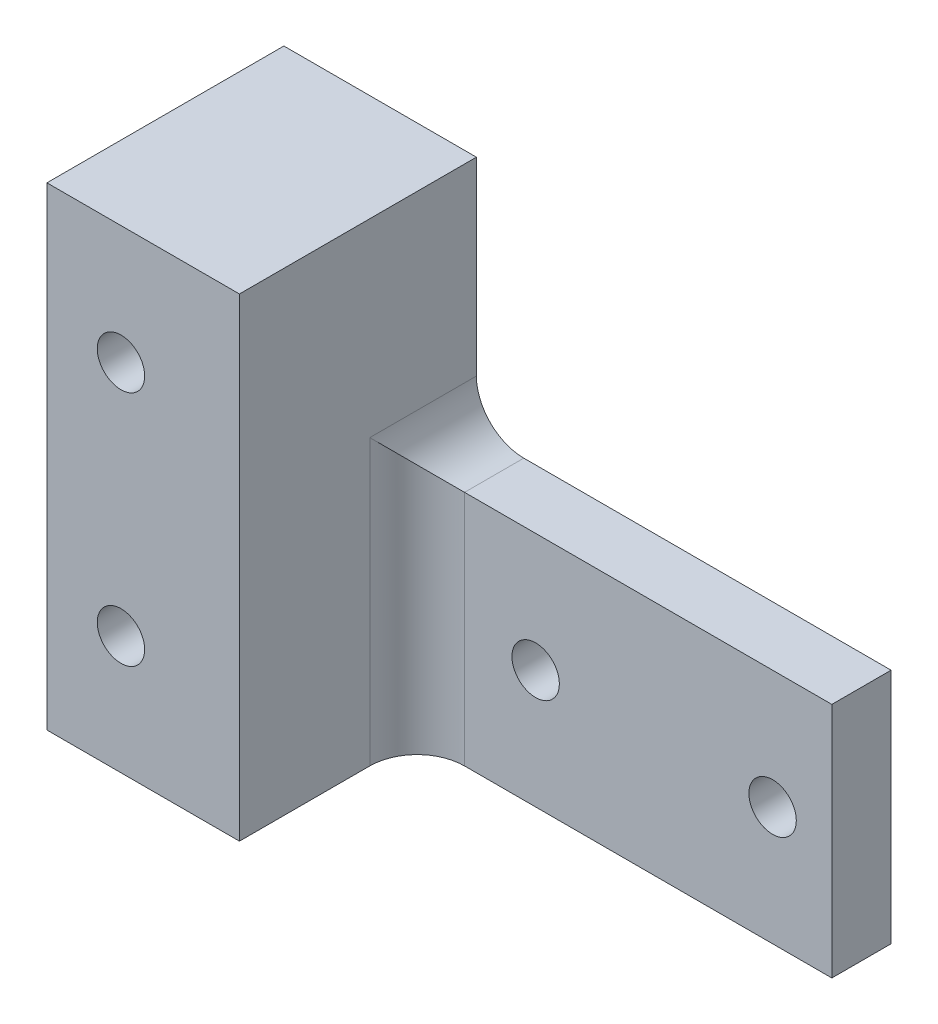
ISO-10303-21;
HEADER;
FILE_DESCRIPTION(('STEP AP214'),'2;1');
FILE_NAME('part.step','',(''),(''),'','','');
FILE_SCHEMA(('AUTOMOTIVE_DESIGN { 1 0 10303 214 1 1 1 1 }'));
ENDSEC;
DATA;
#1=APPLICATION_CONTEXT('core data for automotive mechanical design processes');
#2=APPLICATION_PROTOCOL_DEFINITION('international standard','automotive_design',2000,#1);
#3=PRODUCT_CONTEXT('',#1,'mechanical');
#4=PRODUCT('Part','Part','',(#3));
#5=PRODUCT_RELATED_PRODUCT_CATEGORY('part','',(#4));
#6=PRODUCT_DEFINITION_FORMATION('','',#4);
#7=PRODUCT_DEFINITION_CONTEXT('part definition',#1,'design');
#8=PRODUCT_DEFINITION('design','',#6,#7);
#9=PRODUCT_DEFINITION_SHAPE('','',#8);
#10=(LENGTH_UNIT() NAMED_UNIT(*) SI_UNIT(.MILLI.,.METRE.));
#11=(NAMED_UNIT(*) PLANE_ANGLE_UNIT() SI_UNIT($,.RADIAN.));
#12=(NAMED_UNIT(*) SI_UNIT($,.STERADIAN.) SOLID_ANGLE_UNIT());
#13=UNCERTAINTY_MEASURE_WITH_UNIT(LENGTH_MEASURE(1.E-05),#10,'distance_accuracy_value','');
#14=(GEOMETRIC_REPRESENTATION_CONTEXT(3) GLOBAL_UNCERTAINTY_ASSIGNED_CONTEXT((#13)) GLOBAL_UNIT_ASSIGNED_CONTEXT((#10,
#11,#12)) REPRESENTATION_CONTEXT('',''));
#15=CARTESIAN_POINT('',(0.,0.,0.));
#16=DIRECTION('',(0.,0.,1.));
#17=DIRECTION('',(1.,0.,0.));
#18=AXIS2_PLACEMENT_3D('',#15,#16,#17);
#19=CARTESIAN_POINT('',(12.7,38.1,0.));
#20=DIRECTION('',(0.,0.,1.));
#21=DIRECTION('',(1.,0.,0.));
#22=AXIS2_PLACEMENT_3D('',#19,#20,#21);
#23=CYLINDRICAL_SURFACE('',#22,2.54);
#24=CARTESIAN_POINT('',(12.7,38.1,25.4));
#25=DIRECTION('',(0.,0.,1.));
#26=DIRECTION('',(1.,0.,0.));
#27=AXIS2_PLACEMENT_3D('',#24,#25,#26);
#28=CIRCLE('',#27,2.54);
#29=CARTESIAN_POINT('',(15.24,38.1,25.4));
#30=VERTEX_POINT('',#29);
#31=EDGE_CURVE('E162',#30,#30,#28,.T.);
#32=ORIENTED_EDGE('',*,*,#31,.T.);
#33=EDGE_LOOP('',(#32));
#34=FACE_BOUND('',#33,.T.);
#35=CARTESIAN_POINT('',(12.7,38.1,7.62));
#36=DIRECTION('',(0.,0.,-1.));
#37=DIRECTION('',(-1.,0.,0.));
#38=AXIS2_PLACEMENT_3D('',#35,#36,#37);
#39=CIRCLE('',#38,2.54);
#40=CARTESIAN_POINT('',(10.16,38.1,7.62));
#41=VERTEX_POINT('',#40);
#42=EDGE_CURVE('E49',#41,#41,#39,.F.);
#43=ORIENTED_EDGE('',*,*,#42,.F.);
#44=EDGE_LOOP('',(#43));
#45=FACE_BOUND('',#44,.T.);
#46=ADVANCED_FACE('F45',(#34,#45),#23,.F.);
#47=CARTESIAN_POINT('',(69.85,0.,25.4));
#48=DIRECTION('',(0.,1.,0.));
#49=DIRECTION('',(-1.,0.,0.));
#50=AXIS2_PLACEMENT_3D('',#47,#48,#49);
#51=PLANE('',#50);
#52=DIRECTION('',(0.,0.,-1.));
#53=VECTOR('',#52,1.);
#54=CARTESIAN_POINT('',(69.85,0.,25.4));
#55=LINE('',#54,#53);
#56=CARTESIAN_POINT('',(69.85,0.,6.35));
#57=VERTEX_POINT('',#56);
#58=CARTESIAN_POINT('',(69.85,0.,0.));
#59=VERTEX_POINT('',#58);
#60=EDGE_CURVE('E176',#57,#59,#55,.T.);
#61=ORIENTED_EDGE('',*,*,#60,.F.);
#62=DIRECTION('',(1.,0.,0.));
#63=VECTOR('',#62,1.);
#64=CARTESIAN_POINT('',(69.85,0.,6.35));
#65=LINE('',#64,#63);
#66=CARTESIAN_POINT('',(30.48,0.,6.34999999999999));
#67=VERTEX_POINT('',#66);
#68=EDGE_CURVE('E138',#67,#57,#65,.T.);
#69=ORIENTED_EDGE('',*,*,#68,.F.);
#70=CARTESIAN_POINT('',(30.48,0.,11.43));
#71=DIRECTION('',(0.,1.,0.));
#72=DIRECTION('',(-1.,0.,0.));
#73=AXIS2_PLACEMENT_3D('',#70,#71,#72);
#74=CIRCLE('',#73,5.08);
#75=CARTESIAN_POINT('',(25.4,0.,11.43));
#76=VERTEX_POINT('',#75);
#77=EDGE_CURVE('E12',#67,#76,#74,.T.);
#78=ORIENTED_EDGE('',*,*,#77,.T.);
#79=DIRECTION('',(0.,0.,-1.));
#80=VECTOR('',#79,1.);
#81=CARTESIAN_POINT('',(25.4,0.,25.4));
#82=LINE('',#81,#80);
#83=CARTESIAN_POINT('',(25.4,0.,25.4));
#84=VERTEX_POINT('',#83);
#85=EDGE_CURVE('E119',#84,#76,#82,.T.);
#86=ORIENTED_EDGE('',*,*,#85,.F.);
#87=DIRECTION('',(1.,0.,0.));
#88=VECTOR('',#87,1.);
#89=CARTESIAN_POINT('',(69.85,0.,25.4));
#90=LINE('',#89,#88);
#91=CARTESIAN_POINT('',(4.7625,0.,25.4));
#92=VERTEX_POINT('',#91);
#93=EDGE_CURVE('E129',#92,#84,#90,.T.);
#94=ORIENTED_EDGE('',*,*,#93,.F.);
#95=DIRECTION('',(0.,0.,1.));
#96=VECTOR('',#95,1.);
#97=CARTESIAN_POINT('',(4.7625,0.,0.));
#98=LINE('',#97,#96);
#99=CARTESIAN_POINT('',(4.7625,0.,0.));
#100=VERTEX_POINT('',#99);
#101=EDGE_CURVE('E234',#100,#92,#98,.T.);
#102=ORIENTED_EDGE('',*,*,#101,.F.);
#103=DIRECTION('',(1.,0.,0.));
#104=VECTOR('',#103,1.);
#105=CARTESIAN_POINT('',(69.85,0.,0.));
#106=LINE('',#105,#104);
#107=EDGE_CURVE('E157',#100,#59,#106,.T.);
#108=ORIENTED_EDGE('',*,*,#107,.T.);
#109=EDGE_LOOP('',(#61,#69,#78,#86,#94,#102,#108));
#110=FACE_BOUND('',#109,.T.);
#111=ADVANCED_FACE('F134',(#110),#51,.F.);
#112=CARTESIAN_POINT('',(69.85,25.4,25.4));
#113=DIRECTION('',(-1.,0.,0.));
#114=DIRECTION('',(0.,0.,1.));
#115=AXIS2_PLACEMENT_3D('',#112,#113,#114);
#116=PLANE('',#115);
#117=DIRECTION('',(0.,0.,-1.));
#118=VECTOR('',#117,1.);
#119=CARTESIAN_POINT('',(69.85,25.4,25.4));
#120=LINE('',#119,#118);
#121=CARTESIAN_POINT('',(69.85,25.4,6.35));
#122=VERTEX_POINT('',#121);
#123=CARTESIAN_POINT('',(69.85,25.4,0.));
#124=VERTEX_POINT('',#123);
#125=EDGE_CURVE('E173',#122,#124,#120,.T.);
#126=ORIENTED_EDGE('',*,*,#125,.F.);
#127=DIRECTION('',(0.,-1.,0.));
#128=VECTOR('',#127,1.);
#129=CARTESIAN_POINT('',(69.85,50.8,6.35));
#130=LINE('',#129,#128);
#131=EDGE_CURVE('E185',#122,#57,#130,.T.);
#132=ORIENTED_EDGE('',*,*,#131,.T.);
#133=ORIENTED_EDGE('',*,*,#60,.T.);
#134=DIRECTION('',(0.,1.,0.));
#135=VECTOR('',#134,1.);
#136=CARTESIAN_POINT('',(69.85,25.4,0.));
#137=LINE('',#136,#135);
#138=EDGE_CURVE('E161',#59,#124,#137,.T.);
#139=ORIENTED_EDGE('',*,*,#138,.T.);
#140=EDGE_LOOP('',(#126,#132,#133,#139));
#141=FACE_BOUND('',#140,.T.);
#142=ADVANCED_FACE('F285',(#141),#116,.F.);
#143=CARTESIAN_POINT('',(25.4,25.4,25.4));
#144=DIRECTION('',(0.,-1.,0.));
#145=DIRECTION('',(0.,0.,-1.));
#146=AXIS2_PLACEMENT_3D('',#143,#144,#145);
#147=PLANE('',#146);
#148=DIRECTION('',(-1.,0.,0.));
#149=VECTOR('',#148,1.);
#150=CARTESIAN_POINT('',(25.4,25.4,0.));
#151=LINE('',#150,#149);
#152=CARTESIAN_POINT('',(30.48,25.4,0.));
#153=VERTEX_POINT('',#152);
#154=EDGE_CURVE('E166',#124,#153,#151,.T.);
#155=ORIENTED_EDGE('',*,*,#154,.T.);
#156=DIRECTION('',(0.,0.,-1.));
#157=VECTOR('',#156,1.);
#158=CARTESIAN_POINT('',(30.48,25.4,6.34999999999999));
#159=LINE('',#158,#157);
#160=CARTESIAN_POINT('',(30.48,25.4,6.35));
#161=VERTEX_POINT('',#160);
#162=EDGE_CURVE('E192',#153,#161,#159,.F.);
#163=ORIENTED_EDGE('',*,*,#162,.T.);
#164=DIRECTION('',(1.,0.,0.));
#165=VECTOR('',#164,1.);
#166=CARTESIAN_POINT('',(25.4,25.4,6.34999999999999));
#167=LINE('',#166,#165);
#168=EDGE_CURVE('E227',#161,#122,#167,.T.);
#169=ORIENTED_EDGE('',*,*,#168,.T.);
#170=ORIENTED_EDGE('',*,*,#125,.T.);
#171=EDGE_LOOP('',(#155,#163,#169,#170));
#172=FACE_BOUND('',#171,.T.);
#173=ADVANCED_FACE('F315',(#172),#147,.F.);
#174=CARTESIAN_POINT('',(25.4,50.8,25.4));
#175=DIRECTION('',(-1.,0.,0.));
#176=DIRECTION('',(0.,-1.,0.));
#177=AXIS2_PLACEMENT_3D('',#174,#175,#176);
#178=PLANE('',#177);
#179=DIRECTION('',(0.,-1.,0.));
#180=VECTOR('',#179,1.);
#181=CARTESIAN_POINT('',(25.4,25.4,11.43));
#182=LINE('',#181,#180);
#183=CARTESIAN_POINT('',(25.4,30.48,11.43));
#184=VERTEX_POINT('',#183);
#185=EDGE_CURVE('E179',#76,#184,#182,.F.);
#186=ORIENTED_EDGE('',*,*,#185,.T.);
#187=DIRECTION('',(0.,0.,-1.));
#188=VECTOR('',#187,1.);
#189=CARTESIAN_POINT('',(25.4,30.48,0.));
#190=LINE('',#189,#188);
#191=CARTESIAN_POINT('',(25.4,30.48,0.));
#192=VERTEX_POINT('',#191);
#193=EDGE_CURVE('E188',#184,#192,#190,.T.);
#194=ORIENTED_EDGE('',*,*,#193,.T.);
#195=DIRECTION('',(0.,1.,0.));
#196=VECTOR('',#195,1.);
#197=CARTESIAN_POINT('',(25.4,50.8,0.));
#198=LINE('',#197,#196);
#199=CARTESIAN_POINT('',(25.4,50.8,0.));
#200=VERTEX_POINT('',#199);
#201=EDGE_CURVE('E149',#192,#200,#198,.T.);
#202=ORIENTED_EDGE('',*,*,#201,.T.);
#203=DIRECTION('',(0.,0.,-1.));
#204=VECTOR('',#203,1.);
#205=CARTESIAN_POINT('',(25.4,50.8,25.4));
#206=LINE('',#205,#204);
#207=CARTESIAN_POINT('',(25.4,50.8,25.4));
#208=VERTEX_POINT('',#207);
#209=EDGE_CURVE('E122',#208,#200,#206,.T.);
#210=ORIENTED_EDGE('',*,*,#209,.F.);
#211=DIRECTION('',(0.,1.,0.));
#212=VECTOR('',#211,1.);
#213=CARTESIAN_POINT('',(25.4,50.8,25.4));
#214=LINE('',#213,#212);
#215=EDGE_CURVE('E116',#84,#208,#214,.T.);
#216=ORIENTED_EDGE('',*,*,#215,.F.);
#217=ORIENTED_EDGE('',*,*,#85,.T.);
#218=EDGE_LOOP('',(#186,#194,#202,#210,#216,#217));
#219=FACE_BOUND('',#218,.T.);
#220=ADVANCED_FACE('F118',(#219),#178,.F.);
#221=CARTESIAN_POINT('',(0.,50.8,25.4));
#222=DIRECTION('',(0.,-1.,0.));
#223=DIRECTION('',(0.,0.,-1.));
#224=AXIS2_PLACEMENT_3D('',#221,#222,#223);
#225=PLANE('',#224);
#226=DIRECTION('',(-1.,0.,0.));
#227=VECTOR('',#226,1.);
#228=CARTESIAN_POINT('',(0.,50.8,0.));
#229=LINE('',#228,#227);
#230=CARTESIAN_POINT('',(4.7625,50.8,0.));
#231=VERTEX_POINT('',#230);
#232=EDGE_CURVE('E145',#200,#231,#229,.T.);
#233=ORIENTED_EDGE('',*,*,#232,.T.);
#234=DIRECTION('',(0.,0.,1.));
#235=VECTOR('',#234,1.);
#236=CARTESIAN_POINT('',(4.7625,50.8,0.));
#237=LINE('',#236,#235);
#238=CARTESIAN_POINT('',(4.7625,50.8,25.4));
#239=VERTEX_POINT('',#238);
#240=EDGE_CURVE('E237',#231,#239,#237,.T.);
#241=ORIENTED_EDGE('',*,*,#240,.T.);
#242=DIRECTION('',(-1.,0.,0.));
#243=VECTOR('',#242,1.);
#244=CARTESIAN_POINT('',(0.,50.8,25.4));
#245=LINE('',#244,#243);
#246=EDGE_CURVE('E128',#208,#239,#245,.T.);
#247=ORIENTED_EDGE('',*,*,#246,.F.);
#248=ORIENTED_EDGE('',*,*,#209,.T.);
#249=EDGE_LOOP('',(#233,#241,#247,#248));
#250=FACE_BOUND('',#249,.T.);
#251=ADVANCED_FACE('F304',(#250),#225,.F.);
#252=CARTESIAN_POINT('',(0.,0.,25.4));
#253=DIRECTION('',(0.,0.,-1.));
#254=DIRECTION('',(-1.,0.,0.));
#255=AXIS2_PLACEMENT_3D('',#252,#253,#254);
#256=PLANE('',#255);
#257=ORIENTED_EDGE('',*,*,#31,.F.);
#258=EDGE_LOOP('',(#257));
#259=FACE_BOUND('',#258,.T.);
#260=CARTESIAN_POINT('',(12.7,12.7,25.4));
#261=DIRECTION('',(0.,0.,1.));
#262=DIRECTION('',(1.,0.,0.));
#263=AXIS2_PLACEMENT_3D('',#260,#261,#262);
#264=CIRCLE('',#263,2.54);
#265=CARTESIAN_POINT('',(15.24,12.7,25.4));
#266=VERTEX_POINT('',#265);
#267=EDGE_CURVE('E250',#266,#266,#264,.T.);
#268=ORIENTED_EDGE('',*,*,#267,.F.);
#269=EDGE_LOOP('',(#268));
#270=FACE_BOUND('',#269,.T.);
#271=ORIENTED_EDGE('',*,*,#93,.T.);
#272=ORIENTED_EDGE('',*,*,#215,.T.);
#273=ORIENTED_EDGE('',*,*,#246,.T.);
#274=DIRECTION('',(0.,1.,0.));
#275=VECTOR('',#274,1.);
#276=CARTESIAN_POINT('',(4.7625,0.,25.4));
#277=LINE('',#276,#275);
#278=EDGE_CURVE('E143',#92,#239,#277,.T.);
#279=ORIENTED_EDGE('',*,*,#278,.F.);
#280=EDGE_LOOP('',(#271,#272,#273,#279));
#281=FACE_BOUND('',#280,.T.);
#282=ADVANCED_FACE('F142',(#259,#270,#281),#256,.F.);
#283=CARTESIAN_POINT('',(0.,0.,0.));
#284=DIRECTION('',(0.,0.,-1.));
#285=DIRECTION('',(-1.,0.,0.));
#286=AXIS2_PLACEMENT_3D('',#283,#284,#285);
#287=PLANE('',#286);
#288=CARTESIAN_POINT('',(12.7,38.1,0.));
#289=DIRECTION('',(0.,0.,-1.));
#290=DIRECTION('',(-1.,0.,0.));
#291=AXIS2_PLACEMENT_3D('',#288,#289,#290);
#292=CIRCLE('',#291,4.064);
#293=CARTESIAN_POINT('',(8.636,38.1,0.));
#294=VERTEX_POINT('',#293);
#295=EDGE_CURVE('E211',#294,#294,#292,.T.);
#296=ORIENTED_EDGE('',*,*,#295,.F.);
#297=EDGE_LOOP('',(#296));
#298=FACE_BOUND('',#297,.T.);
#299=DIRECTION('',(0.,1.,0.));
#300=VECTOR('',#299,1.);
#301=CARTESIAN_POINT('',(4.7625,0.,0.));
#302=LINE('',#301,#300);
#303=EDGE_CURVE('E230',#100,#231,#302,.T.);
#304=ORIENTED_EDGE('',*,*,#303,.T.);
#305=ORIENTED_EDGE('',*,*,#232,.F.);
#306=ORIENTED_EDGE('',*,*,#201,.F.);
#307=CARTESIAN_POINT('',(30.48,30.48,0.));
#308=DIRECTION('',(0.,0.,-1.));
#309=DIRECTION('',(-1.,0.,0.));
#310=AXIS2_PLACEMENT_3D('',#307,#308,#309);
#311=CIRCLE('',#310,5.08);
#312=EDGE_CURVE('E55',#192,#153,#311,.F.);
#313=ORIENTED_EDGE('',*,*,#312,.T.);
#314=ORIENTED_EDGE('',*,*,#154,.F.);
#315=ORIENTED_EDGE('',*,*,#138,.F.);
#316=ORIENTED_EDGE('',*,*,#107,.F.);
#317=EDGE_LOOP('',(#304,#305,#306,#313,#314,#315,#316));
#318=FACE_BOUND('',#317,.T.);
#319=CARTESIAN_POINT('',(12.7,12.7,0.));
#320=DIRECTION('',(0.,0.,1.));
#321=DIRECTION('',(1.,0.,0.));
#322=AXIS2_PLACEMENT_3D('',#319,#320,#321);
#323=CIRCLE('',#322,2.54);
#324=CARTESIAN_POINT('',(15.24,12.7,0.));
#325=VERTEX_POINT('',#324);
#326=EDGE_CURVE('E246',#325,#325,#323,.T.);
#327=ORIENTED_EDGE('',*,*,#326,.T.);
#328=EDGE_LOOP('',(#327));
#329=FACE_BOUND('',#328,.T.);
#330=CARTESIAN_POINT('',(38.1,12.7,0.));
#331=DIRECTION('',(0.,0.,1.));
#332=DIRECTION('',(1.,0.,0.));
#333=AXIS2_PLACEMENT_3D('',#330,#331,#332);
#334=CIRCLE('',#333,2.54);
#335=CARTESIAN_POINT('',(40.64,12.7,0.));
#336=VERTEX_POINT('',#335);
#337=EDGE_CURVE('E253',#336,#336,#334,.T.);
#338=ORIENTED_EDGE('',*,*,#337,.T.);
#339=EDGE_LOOP('',(#338));
#340=FACE_BOUND('',#339,.T.);
#341=CARTESIAN_POINT('',(63.5,12.7,0.));
#342=DIRECTION('',(0.,0.,1.));
#343=DIRECTION('',(1.,0.,0.));
#344=AXIS2_PLACEMENT_3D('',#341,#342,#343);
#345=CIRCLE('',#344,2.54);
#346=CARTESIAN_POINT('',(66.04,12.7,0.));
#347=VERTEX_POINT('',#346);
#348=EDGE_CURVE('E152',#347,#347,#345,.T.);
#349=ORIENTED_EDGE('',*,*,#348,.T.);
#350=EDGE_LOOP('',(#349));
#351=FACE_BOUND('',#350,.T.);
#352=ADVANCED_FACE('F262',(#298,#318,#329,#340,#351),#287,.T.);
#353=CARTESIAN_POINT('',(63.5,12.7,0.));
#354=DIRECTION('',(0.,0.,1.));
#355=DIRECTION('',(1.,0.,0.));
#356=AXIS2_PLACEMENT_3D('',#353,#354,#355);
#357=CYLINDRICAL_SURFACE('',#356,2.54);
#358=CARTESIAN_POINT('',(63.5,12.7,6.35));
#359=DIRECTION('',(0.,0.,-1.));
#360=DIRECTION('',(-1.,0.,0.));
#361=AXIS2_PLACEMENT_3D('',#358,#359,#360);
#362=CIRCLE('',#361,2.54);
#363=CARTESIAN_POINT('',(60.96,12.7,6.35));
#364=VERTEX_POINT('',#363);
#365=EDGE_CURVE('E184',#364,#364,#362,.F.);
#366=ORIENTED_EDGE('',*,*,#365,.T.);
#367=EDGE_LOOP('',(#366));
#368=FACE_BOUND('',#367,.T.);
#369=ORIENTED_EDGE('',*,*,#348,.F.);
#370=EDGE_LOOP('',(#369));
#371=FACE_BOUND('',#370,.T.);
#372=ADVANCED_FACE('F264',(#368,#371),#357,.F.);
#373=CARTESIAN_POINT('',(38.1,12.7,0.));
#374=DIRECTION('',(0.,0.,1.));
#375=DIRECTION('',(1.,0.,0.));
#376=AXIS2_PLACEMENT_3D('',#373,#374,#375);
#377=CYLINDRICAL_SURFACE('',#376,2.54);
#378=CARTESIAN_POINT('',(38.1,12.7,6.34999999999999));
#379=DIRECTION('',(0.,0.,-1.));
#380=DIRECTION('',(-1.,0.,0.));
#381=AXIS2_PLACEMENT_3D('',#378,#379,#380);
#382=CIRCLE('',#381,2.54);
#383=CARTESIAN_POINT('',(35.56,12.7,6.34999999999999));
#384=VERTEX_POINT('',#383);
#385=EDGE_CURVE('E180',#384,#384,#382,.F.);
#386=ORIENTED_EDGE('',*,*,#385,.T.);
#387=EDGE_LOOP('',(#386));
#388=FACE_BOUND('',#387,.T.);
#389=ORIENTED_EDGE('',*,*,#337,.F.);
#390=EDGE_LOOP('',(#389));
#391=FACE_BOUND('',#390,.T.);
#392=ADVANCED_FACE('F266',(#388,#391),#377,.F.);
#393=CARTESIAN_POINT('',(12.7,12.7,0.));
#394=DIRECTION('',(0.,0.,1.));
#395=DIRECTION('',(1.,0.,0.));
#396=AXIS2_PLACEMENT_3D('',#393,#394,#395);
#397=CYLINDRICAL_SURFACE('',#396,2.54);
#398=ORIENTED_EDGE('',*,*,#326,.F.);
#399=EDGE_LOOP('',(#398));
#400=FACE_BOUND('',#399,.T.);
#401=ORIENTED_EDGE('',*,*,#267,.T.);
#402=EDGE_LOOP('',(#401));
#403=FACE_BOUND('',#402,.T.);
#404=ADVANCED_FACE('F273',(#400,#403),#397,.F.);
#405=CARTESIAN_POINT('',(4.7625,0.,0.));
#406=DIRECTION('',(1.,0.,0.));
#407=DIRECTION('',(0.,0.,-1.));
#408=AXIS2_PLACEMENT_3D('',#405,#406,#407);
#409=PLANE('',#408);
#410=ORIENTED_EDGE('',*,*,#278,.T.);
#411=ORIENTED_EDGE('',*,*,#240,.F.);
#412=ORIENTED_EDGE('',*,*,#303,.F.);
#413=ORIENTED_EDGE('',*,*,#101,.T.);
#414=EDGE_LOOP('',(#410,#411,#412,#413));
#415=FACE_BOUND('',#414,.T.);
#416=ADVANCED_FACE('F290',(#415),#409,.F.);
#417=CARTESIAN_POINT('',(69.85,50.8,6.35));
#418=DIRECTION('',(0.,0.,-1.));
#419=DIRECTION('',(-1.,0.,0.));
#420=AXIS2_PLACEMENT_3D('',#417,#418,#419);
#421=PLANE('',#420);
#422=ORIENTED_EDGE('',*,*,#385,.F.);
#423=EDGE_LOOP('',(#422));
#424=FACE_BOUND('',#423,.T.);
#425=ORIENTED_EDGE('',*,*,#365,.F.);
#426=EDGE_LOOP('',(#425));
#427=FACE_BOUND('',#426,.T.);
#428=ORIENTED_EDGE('',*,*,#168,.F.);
#429=DIRECTION('',(0.,-1.,0.));
#430=VECTOR('',#429,1.);
#431=CARTESIAN_POINT('',(30.48,0.,6.34999999999999));
#432=LINE('',#431,#430);
#433=EDGE_CURVE('E63',#161,#67,#432,.T.);
#434=ORIENTED_EDGE('',*,*,#433,.T.);
#435=ORIENTED_EDGE('',*,*,#68,.T.);
#436=ORIENTED_EDGE('',*,*,#131,.F.);
#437=EDGE_LOOP('',(#428,#434,#435,#436));
#438=FACE_BOUND('',#437,.T.);
#439=ADVANCED_FACE('F297',(#424,#427,#438),#421,.F.);
#440=CARTESIAN_POINT('',(30.48,50.8,11.43));
#441=DIRECTION('',(0.,1.,0.));
#442=DIRECTION('',(-1.,0.,0.));
#443=AXIS2_PLACEMENT_3D('',#440,#441,#442);
#444=CYLINDRICAL_SURFACE('',#443,5.08);
#445=ORIENTED_EDGE('',*,*,#77,.F.);
#446=ORIENTED_EDGE('',*,*,#433,.F.);
#447=CARTESIAN_POINT('',(30.48,30.48,11.43));
#448=DIRECTION('',(0.,0.707106781186547,-0.707106781186547));
#449=DIRECTION('',(0.,0.707106781186547,0.707106781186547));
#450=AXIS2_PLACEMENT_3D('',#447,#448,#449);
#451=ELLIPSE('',#450,7.18420489685532,5.08);
#452=EDGE_CURVE('E139',#184,#161,#451,.F.);
#453=ORIENTED_EDGE('',*,*,#452,.F.);
#454=ORIENTED_EDGE('',*,*,#185,.F.);
#455=EDGE_LOOP('',(#445,#446,#453,#454));
#456=FACE_BOUND('',#455,.T.);
#457=ADVANCED_FACE('F47',(#456),#444,.F.);
#458=CARTESIAN_POINT('',(30.48,30.48,25.4));
#459=DIRECTION('',(0.,0.,1.));
#460=DIRECTION('',(1.,0.,0.));
#461=AXIS2_PLACEMENT_3D('',#458,#459,#460);
#462=CYLINDRICAL_SURFACE('',#461,5.08);
#463=ORIENTED_EDGE('',*,*,#452,.T.);
#464=ORIENTED_EDGE('',*,*,#162,.F.);
#465=ORIENTED_EDGE('',*,*,#312,.F.);
#466=ORIENTED_EDGE('',*,*,#193,.F.);
#467=EDGE_LOOP('',(#463,#464,#465,#466));
#468=FACE_BOUND('',#467,.T.);
#469=ADVANCED_FACE('F321',(#468),#462,.F.);
#470=CARTESIAN_POINT('',(12.7,38.1,7.62));
#471=DIRECTION('',(0.,0.,-1.));
#472=DIRECTION('',(-1.,0.,0.));
#473=AXIS2_PLACEMENT_3D('',#470,#471,#472);
#474=PLANE('',#473);
#475=CARTESIAN_POINT('',(12.7,38.1,7.62));
#476=DIRECTION('',(0.,0.,-1.));
#477=DIRECTION('',(-1.,0.,0.));
#478=AXIS2_PLACEMENT_3D('',#475,#476,#477);
#479=CIRCLE('',#478,4.064);
#480=CARTESIAN_POINT('',(8.636,38.1,7.62));
#481=VERTEX_POINT('',#480);
#482=EDGE_CURVE('E206',#481,#481,#479,.T.);
#483=ORIENTED_EDGE('',*,*,#482,.T.);
#484=EDGE_LOOP('',(#483));
#485=FACE_BOUND('',#484,.T.);
#486=ORIENTED_EDGE('',*,*,#42,.T.);
#487=EDGE_LOOP('',(#486));
#488=FACE_BOUND('',#487,.T.);
#489=ADVANCED_FACE('F323',(#485,#488),#474,.T.);
#490=CARTESIAN_POINT('',(12.7,38.1,7.62));
#491=DIRECTION('',(0.,0.,-1.));
#492=DIRECTION('',(-1.,0.,0.));
#493=AXIS2_PLACEMENT_3D('',#490,#491,#492);
#494=CYLINDRICAL_SURFACE('',#493,4.064);
#495=CARTESIAN_POINT('',(8.636,38.1,7.62));
#496=CARTESIAN_POINT('',(8.636,38.1,7.540625));
#497=CARTESIAN_POINT('',(8.636,38.1,7.46125));
#498=CARTESIAN_POINT('',(8.636,38.1,7.3025));
#499=CARTESIAN_POINT('',(8.636,38.1,7.223125));
#500=CARTESIAN_POINT('',(8.636,38.1,7.064375));
#501=CARTESIAN_POINT('',(8.636,38.1,6.985));
#502=CARTESIAN_POINT('',(8.636,38.1,6.82625));
#503=CARTESIAN_POINT('',(8.636,38.1,6.746875));
#504=CARTESIAN_POINT('',(8.636,38.1,6.588125));
#505=CARTESIAN_POINT('',(8.636,38.1,6.50875));
#506=CARTESIAN_POINT('',(8.636,38.1,6.35));
#507=CARTESIAN_POINT('',(8.636,38.1,6.270625));
#508=CARTESIAN_POINT('',(8.636,38.1,6.111875));
#509=CARTESIAN_POINT('',(8.636,38.1,6.0325));
#510=CARTESIAN_POINT('',(8.636,38.1,5.87375));
#511=CARTESIAN_POINT('',(8.636,38.1,5.794375));
#512=CARTESIAN_POINT('',(8.636,38.1,5.635625));
#513=CARTESIAN_POINT('',(8.636,38.1,5.55625));
#514=CARTESIAN_POINT('',(8.636,38.1,5.3975));
#515=CARTESIAN_POINT('',(8.636,38.1,5.318125));
#516=CARTESIAN_POINT('',(8.636,38.1,5.159375));
#517=CARTESIAN_POINT('',(8.636,38.1,5.08));
#518=CARTESIAN_POINT('',(8.636,38.1,4.92125));
#519=CARTESIAN_POINT('',(8.636,38.1,4.841875));
#520=CARTESIAN_POINT('',(8.636,38.1,4.683125));
#521=CARTESIAN_POINT('',(8.636,38.1,4.60375));
#522=CARTESIAN_POINT('',(8.636,38.1,4.445));
#523=CARTESIAN_POINT('',(8.636,38.1,4.365625));
#524=CARTESIAN_POINT('',(8.636,38.1,4.206875));
#525=CARTESIAN_POINT('',(8.636,38.1,4.1275));
#526=CARTESIAN_POINT('',(8.636,38.1,3.96875));
#527=CARTESIAN_POINT('',(8.636,38.1,3.889375));
#528=CARTESIAN_POINT('',(8.636,38.1,3.730625));
#529=CARTESIAN_POINT('',(8.636,38.1,3.65125));
#530=CARTESIAN_POINT('',(8.636,38.1,3.4925));
#531=CARTESIAN_POINT('',(8.636,38.1,3.413125));
#532=CARTESIAN_POINT('',(8.636,38.1,3.254375));
#533=CARTESIAN_POINT('',(8.636,38.1,3.175));
#534=CARTESIAN_POINT('',(8.636,38.1,3.01625));
#535=CARTESIAN_POINT('',(8.636,38.1,2.936875));
#536=CARTESIAN_POINT('',(8.636,38.1,2.778125));
#537=CARTESIAN_POINT('',(8.636,38.1,2.69875));
#538=CARTESIAN_POINT('',(8.636,38.1,2.54));
#539=CARTESIAN_POINT('',(8.636,38.1,2.460625));
#540=CARTESIAN_POINT('',(8.636,38.1,2.301875));
#541=CARTESIAN_POINT('',(8.636,38.1,2.2225));
#542=CARTESIAN_POINT('',(8.636,38.1,2.06375));
#543=CARTESIAN_POINT('',(8.636,38.1,1.984375));
#544=CARTESIAN_POINT('',(8.636,38.1,1.825625));
#545=CARTESIAN_POINT('',(8.636,38.1,1.74625));
#546=CARTESIAN_POINT('',(8.636,38.1,1.5875));
#547=CARTESIAN_POINT('',(8.636,38.1,1.508125));
#548=CARTESIAN_POINT('',(8.636,38.1,1.349375));
#549=CARTESIAN_POINT('',(8.636,38.1,1.27));
#550=CARTESIAN_POINT('',(8.636,38.1,1.11125));
#551=CARTESIAN_POINT('',(8.636,38.1,1.031875));
#552=CARTESIAN_POINT('',(8.636,38.1,0.873125));
#553=CARTESIAN_POINT('',(8.636,38.1,0.79375));
#554=CARTESIAN_POINT('',(8.636,38.1,0.635));
#555=CARTESIAN_POINT('',(8.636,38.1,0.555625));
#556=CARTESIAN_POINT('',(8.636,38.1,0.396875));
#557=CARTESIAN_POINT('',(8.636,38.1,0.3175));
#558=CARTESIAN_POINT('',(8.636,38.1,0.15875));
#559=CARTESIAN_POINT('',(8.636,38.1,0.0793749999999999));
#560=CARTESIAN_POINT('',(8.636,38.1,0.));
#561=B_SPLINE_CURVE_WITH_KNOTS('',3,(#495,#496,#497,#498,#499,#500,#501,#502,#503,#504,#505,
#506,#507,#508,#509,#510,#511,#512,#513,#514,#515,#516,#517,#518,#519,#520,#521,#522,#523,#524,
#525,#526,#527,#528,#529,#530,#531,#532,#533,#534,#535,#536,#537,#538,#539,#540,#541,#542,#543,
#544,#545,#546,#547,#548,#549,#550,#551,#552,#553,#554,#555,#556,#557,#558,#559,#560),
.UNSPECIFIED.,.F.,.F.,(4,2,2,2,2,2,2,2,2,2,2,2,2,2,2,2,2,2,2,2,2,2,2,2,2,2,2,2,2,2,2,2,4),(0.,
0.238125,0.47625,0.714375000000001,0.9525,1.190625,1.42875,1.666875,1.905,2.143125,2.38125,
2.619375,2.8575,3.095625,3.33375,3.571875,3.81,4.048125,4.28625,4.524375,4.7625,5.000625,
5.23875,5.476875,5.715,5.953125,6.19125,6.429375,6.6675,6.905625,7.14375,7.381875,7.62),.UNSPECIFIED.);
#562=EDGE_CURVE('BSEAM328',#481,#294,#561,.T.);
#563=ORIENTED_EDGE('',*,*,#482,.F.);
#564=ORIENTED_EDGE('',*,*,#295,.T.);
#565=ORIENTED_EDGE('',*,*,#562,.T.);
#566=ORIENTED_EDGE('',*,*,#562,.F.);
#567=EDGE_LOOP('',(#563,#565,#564,#566));
#568=FACE_BOUND('',#567,.T.);
#569=ADVANCED_FACE('F328',(#568),#494,.F.);
#570=CLOSED_SHELL('',(#46,#111,#142,#173,#220,#251,#282,#352,#372,#392,#404,#416,#439,#457,#469,
#489,#569));
#571=MANIFOLD_SOLID_BREP('B2',#570);
#572=ADVANCED_BREP_SHAPE_REPRESENTATION('',(#18,#571),#14);
#573=SHAPE_DEFINITION_REPRESENTATION(#9,#572);
ENDSEC;
END-ISO-10303-21;
